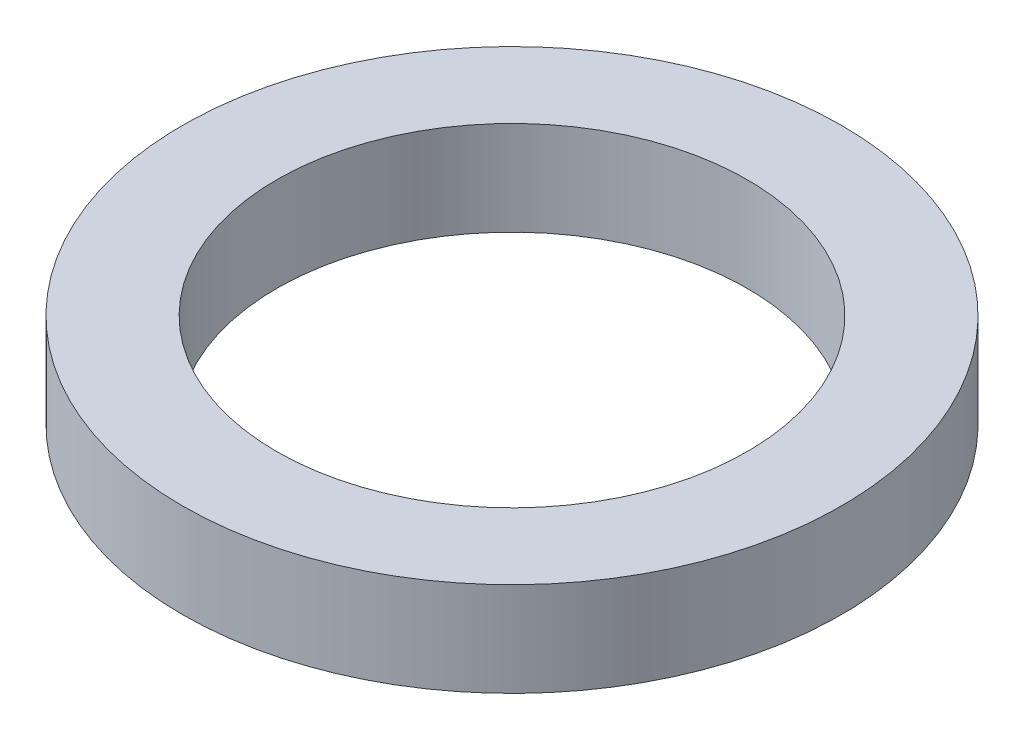
ISO-10303-21;
HEADER;
FILE_DESCRIPTION(('STEP AP214'),'2;1');
FILE_NAME('part.step','',(''),(''),'','','');
FILE_SCHEMA(('AUTOMOTIVE_DESIGN { 1 0 10303 214 1 1 1 1 }'));
ENDSEC;
DATA;
#1=APPLICATION_CONTEXT('core data for automotive mechanical design processes');
#2=APPLICATION_PROTOCOL_DEFINITION('international standard','automotive_design',2000,#1);
#3=PRODUCT_CONTEXT('',#1,'mechanical');
#4=PRODUCT('Part','Part','',(#3));
#5=PRODUCT_RELATED_PRODUCT_CATEGORY('part','',(#4));
#6=PRODUCT_DEFINITION_FORMATION('','',#4);
#7=PRODUCT_DEFINITION_CONTEXT('part definition',#1,'design');
#8=PRODUCT_DEFINITION('design','',#6,#7);
#9=PRODUCT_DEFINITION_SHAPE('','',#8);
#10=(LENGTH_UNIT() NAMED_UNIT(*) SI_UNIT(.MILLI.,.METRE.));
#11=(NAMED_UNIT(*) PLANE_ANGLE_UNIT() SI_UNIT($,.RADIAN.));
#12=(NAMED_UNIT(*) SI_UNIT($,.STERADIAN.) SOLID_ANGLE_UNIT());
#13=UNCERTAINTY_MEASURE_WITH_UNIT(LENGTH_MEASURE(1.E-05),#10,'distance_accuracy_value','');
#14=(GEOMETRIC_REPRESENTATION_CONTEXT(3) GLOBAL_UNCERTAINTY_ASSIGNED_CONTEXT((#13)) GLOBAL_UNIT_ASSIGNED_CONTEXT((#10,
#11,#12)) REPRESENTATION_CONTEXT('',''));
#15=CARTESIAN_POINT('',(0.,0.,0.));
#16=DIRECTION('',(0.,0.,1.));
#17=DIRECTION('',(1.,0.,0.));
#18=AXIS2_PLACEMENT_3D('',#15,#16,#17);
#19=CARTESIAN_POINT('',(0.,1.,0.));
#20=DIRECTION('',(0.,1.,0.));
#21=DIRECTION('',(0.,0.,1.));
#22=AXIS2_PLACEMENT_3D('',#19,#20,#21);
#23=PLANE('',#22);
#24=CARTESIAN_POINT('',(0.,1.,0.));
#25=DIRECTION('',(0.,1.,0.));
#26=DIRECTION('',(0.,0.,1.));
#27=AXIS2_PLACEMENT_3D('',#24,#25,#26);
#28=CIRCLE('',#27,3.5);
#29=CARTESIAN_POINT('',(0.,1.,3.5));
#30=VERTEX_POINT('',#29);
#31=EDGE_CURVE('E10',#30,#30,#28,.T.);
#32=ORIENTED_EDGE('',*,*,#31,.T.);
#33=EDGE_LOOP('',(#32));
#34=FACE_BOUND('',#33,.T.);
#35=CARTESIAN_POINT('',(0.,1.,0.));
#36=DIRECTION('',(0.,1.,0.));
#37=DIRECTION('',(0.,0.,1.));
#38=AXIS2_PLACEMENT_3D('',#35,#36,#37);
#39=CIRCLE('',#38,2.5);
#40=CARTESIAN_POINT('',(0.,1.,2.5));
#41=VERTEX_POINT('',#40);
#42=EDGE_CURVE('E46',#41,#41,#39,.T.);
#43=ORIENTED_EDGE('',*,*,#42,.F.);
#44=EDGE_LOOP('',(#43));
#45=FACE_BOUND('',#44,.T.);
#46=ADVANCED_FACE('F35',(#34,#45),#23,.T.);
#47=CARTESIAN_POINT('',(0.,0.,0.));
#48=DIRECTION('',(0.,1.,0.));
#49=DIRECTION('',(0.,0.,1.));
#50=AXIS2_PLACEMENT_3D('',#47,#48,#49);
#51=PLANE('',#50);
#52=CARTESIAN_POINT('',(0.,0.,0.));
#53=DIRECTION('',(0.,1.,0.));
#54=DIRECTION('',(0.,0.,1.));
#55=AXIS2_PLACEMENT_3D('',#52,#53,#54);
#56=CIRCLE('',#55,3.5);
#57=CARTESIAN_POINT('',(0.,0.,3.5));
#58=VERTEX_POINT('',#57);
#59=EDGE_CURVE('E39',#58,#58,#56,.T.);
#60=ORIENTED_EDGE('',*,*,#59,.F.);
#61=EDGE_LOOP('',(#60));
#62=FACE_BOUND('',#61,.T.);
#63=CARTESIAN_POINT('',(0.,0.,0.));
#64=DIRECTION('',(0.,1.,0.));
#65=DIRECTION('',(0.,0.,1.));
#66=AXIS2_PLACEMENT_3D('',#63,#64,#65);
#67=CIRCLE('',#66,2.5);
#68=CARTESIAN_POINT('',(0.,0.,2.5));
#69=VERTEX_POINT('',#68);
#70=EDGE_CURVE('E48',#69,#69,#67,.T.);
#71=ORIENTED_EDGE('',*,*,#70,.T.);
#72=EDGE_LOOP('',(#71));
#73=FACE_BOUND('',#72,.T.);
#74=ADVANCED_FACE('F58',(#62,#73),#51,.F.);
#75=CARTESIAN_POINT('',(0.,1.,0.));
#76=DIRECTION('',(0.,-1.,0.));
#77=DIRECTION('',(0.,0.,-1.));
#78=AXIS2_PLACEMENT_3D('',#75,#76,#77);
#79=CYLINDRICAL_SURFACE('',#78,3.5);
#80=ORIENTED_EDGE('',*,*,#31,.F.);
#81=EDGE_LOOP('',(#80));
#82=FACE_BOUND('',#81,.T.);
#83=ORIENTED_EDGE('',*,*,#59,.T.);
#84=EDGE_LOOP('',(#83));
#85=FACE_BOUND('',#84,.T.);
#86=ADVANCED_FACE('F37',(#82,#85),#79,.T.);
#87=CARTESIAN_POINT('',(0.,1.,0.));
#88=DIRECTION('',(0.,-1.,0.));
#89=DIRECTION('',(0.,0.,-1.));
#90=AXIS2_PLACEMENT_3D('',#87,#88,#89);
#91=CYLINDRICAL_SURFACE('',#90,2.5);
#92=ORIENTED_EDGE('',*,*,#42,.T.);
#93=EDGE_LOOP('',(#92));
#94=FACE_BOUND('',#93,.T.);
#95=ORIENTED_EDGE('',*,*,#70,.F.);
#96=EDGE_LOOP('',(#95));
#97=FACE_BOUND('',#96,.T.);
#98=ADVANCED_FACE('F54',(#94,#97),#91,.F.);
#99=CLOSED_SHELL('',(#46,#74,#86,#98));
#100=MANIFOLD_SOLID_BREP('B2',#99);
#101=ADVANCED_BREP_SHAPE_REPRESENTATION('',(#18,#100),#14);
#102=SHAPE_DEFINITION_REPRESENTATION(#9,#101);
ENDSEC;
END-ISO-10303-21;
